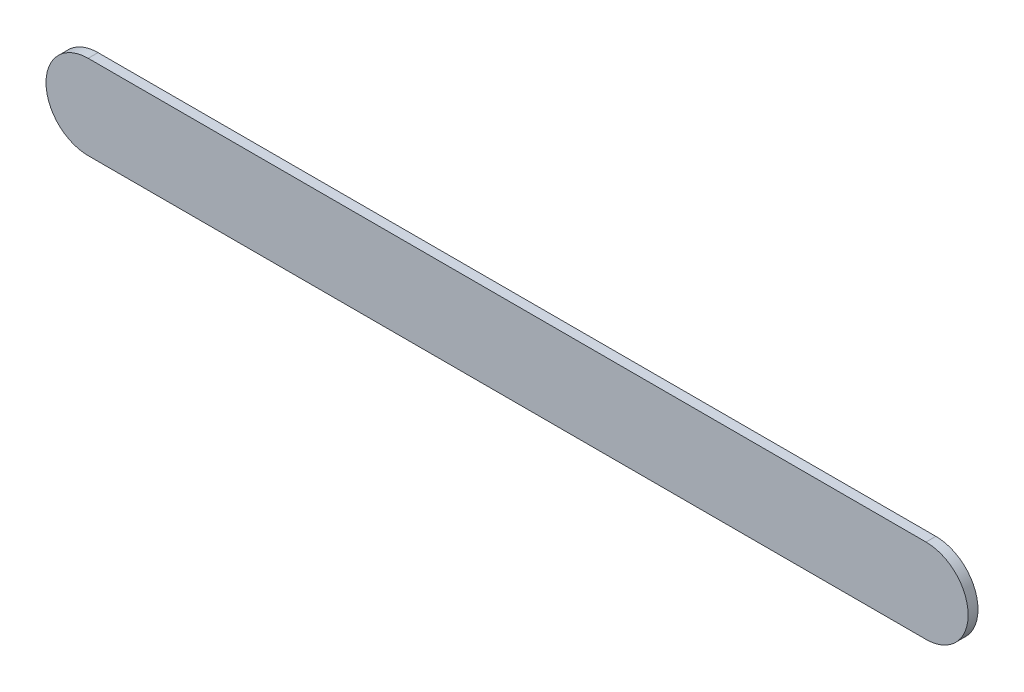
ISO-10303-21;
HEADER;
FILE_DESCRIPTION(('STEP AP214'),'2;1');
FILE_NAME('part.step','',(''),(''),'','','');
FILE_SCHEMA(('AUTOMOTIVE_DESIGN { 1 0 10303 214 1 1 1 1 }'));
ENDSEC;
DATA;
#1=APPLICATION_CONTEXT('core data for automotive mechanical design processes');
#2=APPLICATION_PROTOCOL_DEFINITION('international standard','automotive_design',2000,#1);
#3=PRODUCT_CONTEXT('',#1,'mechanical');
#4=PRODUCT('Part','Part','',(#3));
#5=PRODUCT_RELATED_PRODUCT_CATEGORY('part','',(#4));
#6=PRODUCT_DEFINITION_FORMATION('','',#4);
#7=PRODUCT_DEFINITION_CONTEXT('part definition',#1,'design');
#8=PRODUCT_DEFINITION('design','',#6,#7);
#9=PRODUCT_DEFINITION_SHAPE('','',#8);
#10=(LENGTH_UNIT() NAMED_UNIT(*) SI_UNIT(.MILLI.,.METRE.));
#11=(NAMED_UNIT(*) PLANE_ANGLE_UNIT() SI_UNIT($,.RADIAN.));
#12=(NAMED_UNIT(*) SI_UNIT($,.STERADIAN.) SOLID_ANGLE_UNIT());
#13=UNCERTAINTY_MEASURE_WITH_UNIT(LENGTH_MEASURE(1.E-05),#10,'distance_accuracy_value','');
#14=(GEOMETRIC_REPRESENTATION_CONTEXT(3) GLOBAL_UNCERTAINTY_ASSIGNED_CONTEXT((#13)) GLOBAL_UNIT_ASSIGNED_CONTEXT((#10,
#11,#12)) REPRESENTATION_CONTEXT('',''));
#15=CARTESIAN_POINT('',(0.,0.,0.));
#16=DIRECTION('',(0.,0.,1.));
#17=DIRECTION('',(1.,0.,0.));
#18=AXIS2_PLACEMENT_3D('',#15,#16,#17);
#19=CARTESIAN_POINT('',(120.99,-59.34,1.635));
#20=DIRECTION('',(0.,0.,1.));
#21=DIRECTION('',(1.,0.,0.));
#22=AXIS2_PLACEMENT_3D('',#19,#20,#21);
#23=PLANE('',#22);
#24=DIRECTION('',(-1.,0.,0.));
#25=VECTOR('',#24,1.);
#26=CARTESIAN_POINT('',(120.99,-59.34,1.635));
#27=LINE('',#26,#25);
#28=CARTESIAN_POINT('',(120.99,-59.34,1.635));
#29=VERTEX_POINT('',#28);
#30=CARTESIAN_POINT('',(118.01,-59.34,1.635));
#31=VERTEX_POINT('',#30);
#32=EDGE_CURVE('E84',#29,#31,#27,.T.);
#33=ORIENTED_EDGE('',*,*,#32,.T.);
#34=CARTESIAN_POINT('',(118.01,-59.49,1.635));
#35=DIRECTION('',(0.,0.,1.));
#36=DIRECTION('',(0.,1.,0.));
#37=AXIS2_PLACEMENT_3D('',#34,#35,#36);
#38=CIRCLE('',#37,0.15);
#39=CARTESIAN_POINT('',(118.01,-59.64,1.635));
#40=VERTEX_POINT('',#39);
#41=EDGE_CURVE('E107',#31,#40,#38,.T.);
#42=ORIENTED_EDGE('',*,*,#41,.T.);
#43=DIRECTION('',(1.,0.,0.));
#44=VECTOR('',#43,1.);
#45=CARTESIAN_POINT('',(118.01,-59.64,1.635));
#46=LINE('',#45,#44);
#47=CARTESIAN_POINT('',(120.99,-59.64,1.635));
#48=VERTEX_POINT('',#47);
#49=EDGE_CURVE('E76',#40,#48,#46,.T.);
#50=ORIENTED_EDGE('',*,*,#49,.T.);
#51=CARTESIAN_POINT('',(120.99,-59.49,1.635));
#52=DIRECTION('',(0.,0.,1.));
#53=DIRECTION('',(0.,-1.,0.));
#54=AXIS2_PLACEMENT_3D('',#51,#52,#53);
#55=CIRCLE('',#54,0.15);
#56=EDGE_CURVE('E11',#48,#29,#55,.T.);
#57=ORIENTED_EDGE('',*,*,#56,.T.);
#58=EDGE_LOOP('',(#33,#42,#50,#57));
#59=FACE_BOUND('',#58,.T.);
#60=ADVANCED_FACE('F17',(#59),#23,.T.);
#61=CARTESIAN_POINT('',(120.99,-59.34,1.6));
#62=DIRECTION('',(0.,0.,1.));
#63=DIRECTION('',(1.,0.,0.));
#64=AXIS2_PLACEMENT_3D('',#61,#62,#63);
#65=PLANE('',#64);
#66=CARTESIAN_POINT('',(120.99,-59.49,1.6));
#67=DIRECTION('',(0.,0.,1.));
#68=DIRECTION('',(0.,-1.,0.));
#69=AXIS2_PLACEMENT_3D('',#66,#67,#68);
#70=CIRCLE('',#69,0.15);
#71=CARTESIAN_POINT('',(120.99,-59.64,1.6));
#72=VERTEX_POINT('',#71);
#73=CARTESIAN_POINT('',(120.99,-59.34,1.6));
#74=VERTEX_POINT('',#73);
#75=EDGE_CURVE('E27',#72,#74,#70,.T.);
#76=ORIENTED_EDGE('',*,*,#75,.F.);
#77=DIRECTION('',(1.,0.,0.));
#78=VECTOR('',#77,1.);
#79=CARTESIAN_POINT('',(118.01,-59.64,1.6));
#80=LINE('',#79,#78);
#81=CARTESIAN_POINT('',(118.01,-59.64,1.6));
#82=VERTEX_POINT('',#81);
#83=EDGE_CURVE('E110',#82,#72,#80,.T.);
#84=ORIENTED_EDGE('',*,*,#83,.F.);
#85=CARTESIAN_POINT('',(118.01,-59.49,1.6));
#86=DIRECTION('',(0.,0.,1.));
#87=DIRECTION('',(0.,1.,0.));
#88=AXIS2_PLACEMENT_3D('',#85,#86,#87);
#89=CIRCLE('',#88,0.15);
#90=CARTESIAN_POINT('',(118.01,-59.34,1.6));
#91=VERTEX_POINT('',#90);
#92=EDGE_CURVE('E86',#91,#82,#89,.T.);
#93=ORIENTED_EDGE('',*,*,#92,.F.);
#94=DIRECTION('',(-1.,0.,0.));
#95=VECTOR('',#94,1.);
#96=CARTESIAN_POINT('',(120.99,-59.34,1.6));
#97=LINE('',#96,#95);
#98=EDGE_CURVE('E82',#74,#91,#97,.T.);
#99=ORIENTED_EDGE('',*,*,#98,.F.);
#100=EDGE_LOOP('',(#76,#84,#93,#99));
#101=FACE_BOUND('',#100,.T.);
#102=ADVANCED_FACE('F19',(#101),#65,.F.);
#103=CARTESIAN_POINT('',(120.99,-59.49,1.6));
#104=DIRECTION('',(0.,0.,-1.));
#105=DIRECTION('',(0.,-1.,0.));
#106=AXIS2_PLACEMENT_3D('',#103,#104,#105);
#107=CYLINDRICAL_SURFACE('',#106,0.15);
#108=ORIENTED_EDGE('',*,*,#75,.T.);
#109=DIRECTION('',(0.,0.,1.));
#110=VECTOR('',#109,1.);
#111=CARTESIAN_POINT('',(120.99,-59.34,1.6));
#112=LINE('',#111,#110);
#113=EDGE_CURVE('E71',#74,#29,#112,.T.);
#114=ORIENTED_EDGE('',*,*,#113,.T.);
#115=ORIENTED_EDGE('',*,*,#56,.F.);
#116=DIRECTION('',(0.,0.,1.));
#117=VECTOR('',#116,1.);
#118=CARTESIAN_POINT('',(120.99,-59.64,1.6));
#119=LINE('',#118,#117);
#120=EDGE_CURVE('E21',#72,#48,#119,.T.);
#121=ORIENTED_EDGE('',*,*,#120,.F.);
#122=EDGE_LOOP('',(#108,#114,#115,#121));
#123=FACE_BOUND('',#122,.T.);
#124=ADVANCED_FACE('F70',(#123),#107,.T.);
#125=CARTESIAN_POINT('',(118.01,-59.64,1.6));
#126=DIRECTION('',(0.,1.,0.));
#127=DIRECTION('',(1.,0.,0.));
#128=AXIS2_PLACEMENT_3D('',#125,#126,#127);
#129=PLANE('',#128);
#130=ORIENTED_EDGE('',*,*,#83,.T.);
#131=ORIENTED_EDGE('',*,*,#120,.T.);
#132=ORIENTED_EDGE('',*,*,#49,.F.);
#133=DIRECTION('',(0.,0.,1.));
#134=VECTOR('',#133,1.);
#135=CARTESIAN_POINT('',(118.01,-59.64,1.6));
#136=LINE('',#135,#134);
#137=EDGE_CURVE('E102',#82,#40,#136,.T.);
#138=ORIENTED_EDGE('',*,*,#137,.F.);
#139=EDGE_LOOP('',(#130,#131,#132,#138));
#140=FACE_BOUND('',#139,.T.);
#141=ADVANCED_FACE('F121',(#140),#129,.F.);
#142=CARTESIAN_POINT('',(118.01,-59.49,1.6));
#143=DIRECTION('',(0.,0.,-1.));
#144=DIRECTION('',(0.,1.,0.));
#145=AXIS2_PLACEMENT_3D('',#142,#143,#144);
#146=CYLINDRICAL_SURFACE('',#145,0.15);
#147=ORIENTED_EDGE('',*,*,#92,.T.);
#148=ORIENTED_EDGE('',*,*,#137,.T.);
#149=ORIENTED_EDGE('',*,*,#41,.F.);
#150=DIRECTION('',(0.,0.,1.));
#151=VECTOR('',#150,1.);
#152=CARTESIAN_POINT('',(118.01,-59.34,1.6));
#153=LINE('',#152,#151);
#154=EDGE_CURVE('E91',#91,#31,#153,.T.);
#155=ORIENTED_EDGE('',*,*,#154,.F.);
#156=EDGE_LOOP('',(#147,#148,#149,#155));
#157=FACE_BOUND('',#156,.T.);
#158=ADVANCED_FACE('F124',(#157),#146,.T.);
#159=CARTESIAN_POINT('',(120.99,-59.34,1.6));
#160=DIRECTION('',(0.,-1.,0.));
#161=DIRECTION('',(0.,0.,-1.));
#162=AXIS2_PLACEMENT_3D('',#159,#160,#161);
#163=PLANE('',#162);
#164=ORIENTED_EDGE('',*,*,#98,.T.);
#165=ORIENTED_EDGE('',*,*,#154,.T.);
#166=ORIENTED_EDGE('',*,*,#32,.F.);
#167=ORIENTED_EDGE('',*,*,#113,.F.);
#168=EDGE_LOOP('',(#164,#165,#166,#167));
#169=FACE_BOUND('',#168,.T.);
#170=ADVANCED_FACE('F80',(#169),#163,.F.);
#171=CLOSED_SHELL('',(#60,#102,#124,#141,#158,#170));
#172=MANIFOLD_SOLID_BREP('B1',#171);
#173=ADVANCED_BREP_SHAPE_REPRESENTATION('',(#18,#172),#14);
#174=SHAPE_DEFINITION_REPRESENTATION(#9,#173);
ENDSEC;
END-ISO-10303-21;
